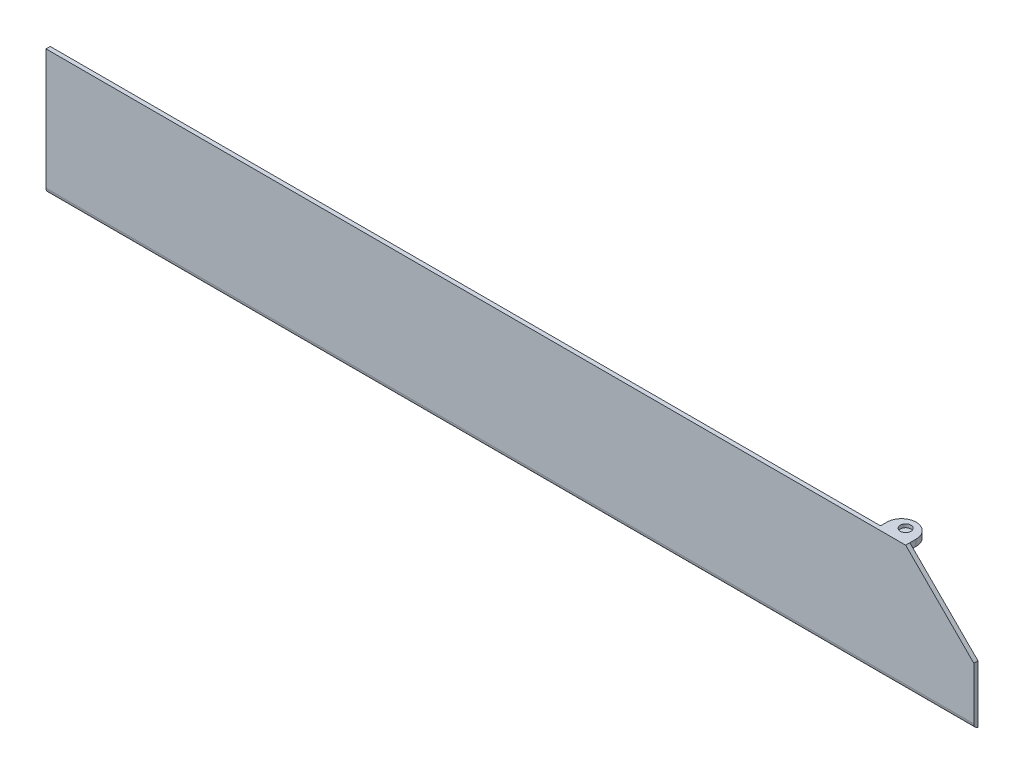
ISO-10303-21;
HEADER;
FILE_DESCRIPTION(('STEP AP214'),'2;1');
FILE_NAME('part.step','',(''),(''),'','','');
FILE_SCHEMA(('AUTOMOTIVE_DESIGN { 1 0 10303 214 1 1 1 1 }'));
ENDSEC;
DATA;
#1=APPLICATION_CONTEXT('core data for automotive mechanical design processes');
#2=APPLICATION_PROTOCOL_DEFINITION('international standard','automotive_design',2000,#1);
#3=PRODUCT_CONTEXT('',#1,'mechanical');
#4=PRODUCT('Part','Part','',(#3));
#5=PRODUCT_RELATED_PRODUCT_CATEGORY('part','',(#4));
#6=PRODUCT_DEFINITION_FORMATION('','',#4);
#7=PRODUCT_DEFINITION_CONTEXT('part definition',#1,'design');
#8=PRODUCT_DEFINITION('design','',#6,#7);
#9=PRODUCT_DEFINITION_SHAPE('','',#8);
#10=(LENGTH_UNIT() NAMED_UNIT(*) SI_UNIT(.MILLI.,.METRE.));
#11=(NAMED_UNIT(*) PLANE_ANGLE_UNIT() SI_UNIT($,.RADIAN.));
#12=(NAMED_UNIT(*) SI_UNIT($,.STERADIAN.) SOLID_ANGLE_UNIT());
#13=UNCERTAINTY_MEASURE_WITH_UNIT(LENGTH_MEASURE(1.E-05),#10,'distance_accuracy_value','');
#14=(GEOMETRIC_REPRESENTATION_CONTEXT(3) GLOBAL_UNCERTAINTY_ASSIGNED_CONTEXT((#13)) GLOBAL_UNIT_ASSIGNED_CONTEXT((#10,
#11,#12)) REPRESENTATION_CONTEXT('',''));
#15=CARTESIAN_POINT('',(0.,0.,0.));
#16=DIRECTION('',(0.,0.,1.));
#17=DIRECTION('',(1.,0.,0.));
#18=AXIS2_PLACEMENT_3D('',#15,#16,#17);
#19=CARTESIAN_POINT('',(0.,0.,0.));
#20=DIRECTION('',(0.,0.,1.));
#21=DIRECTION('',(1.,0.,0.));
#22=AXIS2_PLACEMENT_3D('',#19,#20,#21);
#23=PLANE('',#22);
#24=DIRECTION('',(0.,-1.,0.));
#25=VECTOR('',#24,1.);
#26=CARTESIAN_POINT('',(865.,35.,0.));
#27=LINE('',#26,#25);
#28=CARTESIAN_POINT('',(865.,35.,0.));
#29=VERTEX_POINT('',#28);
#30=CARTESIAN_POINT('',(865.,25.,0.));
#31=VERTEX_POINT('',#30);
#32=EDGE_CURVE('E241',#29,#31,#27,.T.);
#33=ORIENTED_EDGE('',*,*,#32,.F.);
#34=DIRECTION('',(1.,0.,0.));
#35=VECTOR('',#34,1.);
#36=CARTESIAN_POINT('',(865.,35.,0.));
#37=LINE('',#36,#35);
#38=CARTESIAN_POINT('',(860.,35.,0.));
#39=VERTEX_POINT('',#38);
#40=EDGE_CURVE('E250',#39,#29,#37,.T.);
#41=ORIENTED_EDGE('',*,*,#40,.F.);
#42=DIRECTION('',(0.,1.,0.));
#43=VECTOR('',#42,1.);
#44=CARTESIAN_POINT('',(860.,35.,0.));
#45=LINE('',#44,#43);
#46=CARTESIAN_POINT('',(860.,25.,0.));
#47=VERTEX_POINT('',#46);
#48=EDGE_CURVE('E247',#47,#39,#45,.T.);
#49=ORIENTED_EDGE('',*,*,#48,.F.);
#50=DIRECTION('',(-1.,0.,0.));
#51=VECTOR('',#50,1.);
#52=CARTESIAN_POINT('',(865.,25.,0.));
#53=LINE('',#52,#51);
#54=EDGE_CURVE('E244',#31,#47,#53,.T.);
#55=ORIENTED_EDGE('',*,*,#54,.F.);
#56=EDGE_LOOP('',(#33,#41,#49,#55));
#57=FACE_BOUND('',#56,.T.);
#58=DIRECTION('',(0.,-1.,0.));
#59=VECTOR('',#58,1.);
#60=CARTESIAN_POINT('',(25.,85.0000000000001,0.));
#61=LINE('',#60,#59);
#62=CARTESIAN_POINT('',(25.,95.0000000000001,0.));
#63=VERTEX_POINT('',#62);
#64=CARTESIAN_POINT('',(25.,85.0000000000001,0.));
#65=VERTEX_POINT('',#64);
#66=EDGE_CURVE('E293',#63,#65,#61,.T.);
#67=ORIENTED_EDGE('',*,*,#66,.F.);
#68=DIRECTION('',(1.,0.,0.));
#69=VECTOR('',#68,1.);
#70=CARTESIAN_POINT('',(25.,95.0000000000001,0.));
#71=LINE('',#70,#69);
#72=CARTESIAN_POINT('',(20.,95.0000000000001,0.));
#73=VERTEX_POINT('',#72);
#74=EDGE_CURVE('E302',#73,#63,#71,.T.);
#75=ORIENTED_EDGE('',*,*,#74,.F.);
#76=DIRECTION('',(0.,1.,0.));
#77=VECTOR('',#76,1.);
#78=CARTESIAN_POINT('',(20.,85.0000000000001,0.));
#79=LINE('',#78,#77);
#80=CARTESIAN_POINT('',(20.,85.0000000000001,0.));
#81=VERTEX_POINT('',#80);
#82=EDGE_CURVE('E299',#81,#73,#79,.T.);
#83=ORIENTED_EDGE('',*,*,#82,.F.);
#84=DIRECTION('',(-1.,0.,0.));
#85=VECTOR('',#84,1.);
#86=CARTESIAN_POINT('',(25.,85.0000000000001,0.));
#87=LINE('',#86,#85);
#88=EDGE_CURVE('E296',#65,#81,#87,.T.);
#89=ORIENTED_EDGE('',*,*,#88,.F.);
#90=EDGE_LOOP('',(#67,#75,#83,#89));
#91=FACE_BOUND('',#90,.T.);
#92=DIRECTION('',(0.,1.,0.));
#93=VECTOR('',#92,1.);
#94=CARTESIAN_POINT('',(20.,30.0000000000001,0.));
#95=LINE('',#94,#93);
#96=CARTESIAN_POINT('',(20.,30.0000000000001,0.));
#97=VERTEX_POINT('',#96);
#98=CARTESIAN_POINT('',(20.,40.0000000000001,0.));
#99=VERTEX_POINT('',#98);
#100=EDGE_CURVE('E290',#97,#99,#95,.T.);
#101=ORIENTED_EDGE('',*,*,#100,.F.);
#102=DIRECTION('',(-1.,0.,0.));
#103=VECTOR('',#102,1.);
#104=CARTESIAN_POINT('',(20.,30.0000000000001,0.));
#105=LINE('',#104,#103);
#106=CARTESIAN_POINT('',(25.,30.0000000000001,0.));
#107=VERTEX_POINT('',#106);
#108=EDGE_CURVE('E281',#107,#97,#105,.T.);
#109=ORIENTED_EDGE('',*,*,#108,.F.);
#110=DIRECTION('',(0.,-1.,0.));
#111=VECTOR('',#110,1.);
#112=CARTESIAN_POINT('',(25.,30.0000000000001,0.));
#113=LINE('',#112,#111);
#114=CARTESIAN_POINT('',(25.,40.0000000000001,0.));
#115=VERTEX_POINT('',#114);
#116=EDGE_CURVE('E284',#115,#107,#113,.T.);
#117=ORIENTED_EDGE('',*,*,#116,.F.);
#118=DIRECTION('',(1.,0.,0.));
#119=VECTOR('',#118,1.);
#120=CARTESIAN_POINT('',(20.,40.0000000000001,0.));
#121=LINE('',#120,#119);
#122=EDGE_CURVE('E287',#99,#115,#121,.T.);
#123=ORIENTED_EDGE('',*,*,#122,.F.);
#124=EDGE_LOOP('',(#101,#109,#117,#123));
#125=FACE_BOUND('',#124,.T.);
#126=DIRECTION('',(0.,-1.,0.));
#127=VECTOR('',#126,1.);
#128=CARTESIAN_POINT('',(820.,120.,0.));
#129=LINE('',#128,#127);
#130=CARTESIAN_POINT('',(820.,120.,0.));
#131=VERTEX_POINT('',#130);
#132=CARTESIAN_POINT('',(820.,114.,0.));
#133=VERTEX_POINT('',#132);
#134=EDGE_CURVE('E217',#131,#133,#129,.T.);
#135=ORIENTED_EDGE('',*,*,#134,.F.);
#136=DIRECTION('',(-0.70710678118655,0.707106781186545,0.));
#137=VECTOR('',#136,1.);
#138=CARTESIAN_POINT('',(885.,55.,0.));
#139=LINE('',#138,#137);
#140=CARTESIAN_POINT('',(885.,55.,0.));
#141=VERTEX_POINT('',#140);
#142=EDGE_CURVE('E329',#141,#131,#139,.T.);
#143=ORIENTED_EDGE('',*,*,#142,.F.);
#144=DIRECTION('',(0.,1.,0.));
#145=VECTOR('',#144,1.);
#146=CARTESIAN_POINT('',(885.,0.,0.));
#147=LINE('',#146,#145);
#148=CARTESIAN_POINT('',(885.,0.,0.));
#149=VERTEX_POINT('',#148);
#150=EDGE_CURVE('E327',#149,#141,#147,.T.);
#151=ORIENTED_EDGE('',*,*,#150,.F.);
#152=DIRECTION('',(1.,0.,0.));
#153=VECTOR('',#152,1.);
#154=CARTESIAN_POINT('',(0.,0.,0.));
#155=LINE('',#154,#153);
#156=CARTESIAN_POINT('',(0.,0.,0.));
#157=VERTEX_POINT('',#156);
#158=EDGE_CURVE('E325',#157,#149,#155,.T.);
#159=ORIENTED_EDGE('',*,*,#158,.F.);
#160=DIRECTION('',(0.,-1.,0.));
#161=VECTOR('',#160,1.);
#162=CARTESIAN_POINT('',(0.,120.,0.));
#163=LINE('',#162,#161);
#164=CARTESIAN_POINT('',(0.,120.,0.));
#165=VERTEX_POINT('',#164);
#166=EDGE_CURVE('E313',#165,#157,#163,.T.);
#167=ORIENTED_EDGE('',*,*,#166,.F.);
#168=DIRECTION('',(-1.,0.,0.));
#169=VECTOR('',#168,1.);
#170=CARTESIAN_POINT('',(820.,120.,0.));
#171=LINE('',#170,#169);
#172=CARTESIAN_POINT('',(791.999999999999,120.,0.));
#173=VERTEX_POINT('',#172);
#174=EDGE_CURVE('E317',#173,#165,#171,.T.);
#175=ORIENTED_EDGE('',*,*,#174,.F.);
#176=DIRECTION('',(0.,1.,0.));
#177=VECTOR('',#176,1.);
#178=CARTESIAN_POINT('',(791.999999999999,120.,0.));
#179=LINE('',#178,#177);
#180=CARTESIAN_POINT('',(791.999999999999,114.,0.));
#181=VERTEX_POINT('',#180);
#182=EDGE_CURVE('E228',#181,#173,#179,.T.);
#183=ORIENTED_EDGE('',*,*,#182,.F.);
#184=DIRECTION('',(-1.,0.,0.));
#185=VECTOR('',#184,1.);
#186=CARTESIAN_POINT('',(820.,114.,0.));
#187=LINE('',#186,#185);
#188=EDGE_CURVE('E207',#133,#181,#187,.T.);
#189=ORIENTED_EDGE('',*,*,#188,.F.);
#190=EDGE_LOOP('',(#135,#143,#151,#159,#167,#175,#183,#189));
#191=FACE_BOUND('',#190,.T.);
#192=ADVANCED_FACE('F38',(#57,#91,#125,#191),#23,.F.);
#193=CARTESIAN_POINT('',(0.,120.,4.));
#194=DIRECTION('',(1.,0.,0.));
#195=DIRECTION('',(0.,0.,-1.));
#196=AXIS2_PLACEMENT_3D('',#193,#194,#195);
#197=PLANE('',#196);
#198=ORIENTED_EDGE('',*,*,#166,.T.);
#199=CARTESIAN_POINT('',(0.,4.89897948556636,-1.));
#200=DIRECTION('',(1.,0.,0.));
#201=DIRECTION('',(0.,0.,-1.));
#202=AXIS2_PLACEMENT_3D('',#199,#200,#201);
#203=CIRCLE('',#202,5.);
#204=CARTESIAN_POINT('',(0.,4.89897948556636,4.));
#205=VERTEX_POINT('',#204);
#206=EDGE_CURVE('E11',#157,#205,#203,.F.);
#207=ORIENTED_EDGE('',*,*,#206,.T.);
#208=DIRECTION('',(0.,-1.,0.));
#209=VECTOR('',#208,1.);
#210=CARTESIAN_POINT('',(0.,120.,4.));
#211=LINE('',#210,#209);
#212=CARTESIAN_POINT('',(0.,120.,4.));
#213=VERTEX_POINT('',#212);
#214=EDGE_CURVE('E314',#213,#205,#211,.T.);
#215=ORIENTED_EDGE('',*,*,#214,.F.);
#216=DIRECTION('',(0.,0.,-1.));
#217=VECTOR('',#216,1.);
#218=CARTESIAN_POINT('',(0.,120.,4.));
#219=LINE('',#218,#217);
#220=EDGE_CURVE('E323',#213,#165,#219,.T.);
#221=ORIENTED_EDGE('',*,*,#220,.T.);
#222=EDGE_LOOP('',(#198,#207,#215,#221));
#223=FACE_BOUND('',#222,.T.);
#224=ADVANCED_FACE('F416',(#223),#197,.F.);
#225=CARTESIAN_POINT('',(885.,0.,4.));
#226=DIRECTION('',(-1.,0.,0.));
#227=DIRECTION('',(0.,0.,1.));
#228=AXIS2_PLACEMENT_3D('',#225,#226,#227);
#229=PLANE('',#228);
#230=DIRECTION('',(0.,1.,0.));
#231=VECTOR('',#230,1.);
#232=CARTESIAN_POINT('',(885.,0.,4.));
#233=LINE('',#232,#231);
#234=CARTESIAN_POINT('',(885.,4.89897948556636,4.));
#235=VERTEX_POINT('',#234);
#236=CARTESIAN_POINT('',(885.,55.,4.));
#237=VERTEX_POINT('',#236);
#238=EDGE_CURVE('E316',#235,#237,#233,.T.);
#239=ORIENTED_EDGE('',*,*,#238,.F.);
#240=CARTESIAN_POINT('',(885.,4.89897948556636,-1.));
#241=DIRECTION('',(-1.,0.,0.));
#242=DIRECTION('',(0.,0.,1.));
#243=AXIS2_PLACEMENT_3D('',#240,#241,#242);
#244=CIRCLE('',#243,5.);
#245=EDGE_CURVE('E46',#235,#149,#244,.F.);
#246=ORIENTED_EDGE('',*,*,#245,.T.);
#247=ORIENTED_EDGE('',*,*,#150,.T.);
#248=DIRECTION('',(0.,0.,-1.));
#249=VECTOR('',#248,1.);
#250=CARTESIAN_POINT('',(885.,55.,4.));
#251=LINE('',#250,#249);
#252=EDGE_CURVE('E337',#237,#141,#251,.T.);
#253=ORIENTED_EDGE('',*,*,#252,.F.);
#254=EDGE_LOOP('',(#239,#246,#247,#253));
#255=FACE_BOUND('',#254,.T.);
#256=ADVANCED_FACE('F409',(#255),#229,.F.);
#257=CARTESIAN_POINT('',(885.,55.,4.));
#258=DIRECTION('',(-0.707106781186545,-0.70710678118655,0.));
#259=DIRECTION('',(0.70710678118655,-0.707106781186545,0.));
#260=AXIS2_PLACEMENT_3D('',#257,#258,#259);
#261=PLANE('',#260);
#262=ORIENTED_EDGE('',*,*,#142,.T.);
#263=DIRECTION('',(0.,0.,-1.));
#264=VECTOR('',#263,1.);
#265=CARTESIAN_POINT('',(820.,120.,4.));
#266=LINE('',#265,#264);
#267=CARTESIAN_POINT('',(820.,120.,4.));
#268=VERTEX_POINT('',#267);
#269=EDGE_CURVE('E334',#268,#131,#266,.T.);
#270=ORIENTED_EDGE('',*,*,#269,.F.);
#271=DIRECTION('',(-0.70710678118655,0.707106781186545,0.));
#272=VECTOR('',#271,1.);
#273=CARTESIAN_POINT('',(885.,55.,4.));
#274=LINE('',#273,#272);
#275=EDGE_CURVE('E319',#237,#268,#274,.T.);
#276=ORIENTED_EDGE('',*,*,#275,.F.);
#277=ORIENTED_EDGE('',*,*,#252,.T.);
#278=EDGE_LOOP('',(#262,#270,#276,#277));
#279=FACE_BOUND('',#278,.T.);
#280=ADVANCED_FACE('F452',(#279),#261,.F.);
#281=CARTESIAN_POINT('',(820.,120.,4.));
#282=DIRECTION('',(0.,-1.,0.));
#283=DIRECTION('',(1.,0.,0.));
#284=AXIS2_PLACEMENT_3D('',#281,#282,#283);
#285=PLANE('',#284);
#286=CARTESIAN_POINT('',(806.,120.,-10.));
#287=DIRECTION('',(0.,1.,0.));
#288=DIRECTION('',(-1.,0.,0.));
#289=AXIS2_PLACEMENT_3D('',#286,#287,#288);
#290=CIRCLE('',#289,5.09999999999998);
#291=CARTESIAN_POINT('',(800.9,120.,-10.));
#292=VERTEX_POINT('',#291);
#293=EDGE_CURVE('E405',#292,#292,#290,.T.);
#294=ORIENTED_EDGE('',*,*,#293,.F.);
#295=EDGE_LOOP('',(#294));
#296=FACE_BOUND('',#295,.T.);
#297=CARTESIAN_POINT('',(806.,120.,-6.));
#298=DIRECTION('',(0.,-1.,0.));
#299=DIRECTION('',(1.,0.,0.));
#300=AXIS2_PLACEMENT_3D('',#297,#298,#299);
#301=CIRCLE('',#300,14.);
#302=CARTESIAN_POINT('',(820.,120.,-6.));
#303=VERTEX_POINT('',#302);
#304=CARTESIAN_POINT('',(806.,120.,-20.));
#305=VERTEX_POINT('',#304);
#306=EDGE_CURVE('E387',#303,#305,#301,.F.);
#307=ORIENTED_EDGE('',*,*,#306,.T.);
#308=CARTESIAN_POINT('',(806.,120.,-6.));
#309=DIRECTION('',(0.,-1.,0.));
#310=DIRECTION('',(1.,0.,0.));
#311=AXIS2_PLACEMENT_3D('',#308,#309,#310);
#312=CIRCLE('',#311,14.);
#313=CARTESIAN_POINT('',(791.999999999999,120.,-6.));
#314=VERTEX_POINT('',#313);
#315=EDGE_CURVE('E391',#305,#314,#312,.F.);
#316=ORIENTED_EDGE('',*,*,#315,.T.);
#317=DIRECTION('',(0.,0.,1.));
#318=VECTOR('',#317,1.);
#319=CARTESIAN_POINT('',(791.999999999999,120.,-20.));
#320=LINE('',#319,#318);
#321=EDGE_CURVE('E234',#314,#173,#320,.T.);
#322=ORIENTED_EDGE('',*,*,#321,.T.);
#323=ORIENTED_EDGE('',*,*,#174,.T.);
#324=ORIENTED_EDGE('',*,*,#220,.F.);
#325=DIRECTION('',(-1.,0.,0.));
#326=VECTOR('',#325,1.);
#327=CARTESIAN_POINT('',(820.,120.,4.));
#328=LINE('',#327,#326);
#329=EDGE_CURVE('E321',#268,#213,#328,.T.);
#330=ORIENTED_EDGE('',*,*,#329,.F.);
#331=ORIENTED_EDGE('',*,*,#269,.T.);
#332=DIRECTION('',(0.,0.,1.));
#333=VECTOR('',#332,1.);
#334=CARTESIAN_POINT('',(820.,120.,-20.));
#335=LINE('',#334,#333);
#336=EDGE_CURVE('E220',#303,#131,#335,.T.);
#337=ORIENTED_EDGE('',*,*,#336,.F.);
#338=EDGE_LOOP('',(#307,#316,#322,#323,#324,#330,#331,#337));
#339=FACE_BOUND('',#338,.T.);
#340=ADVANCED_FACE('F418',(#296,#339),#285,.F.);
#341=CARTESIAN_POINT('',(0.,0.,4.));
#342=DIRECTION('',(0.,0.,1.));
#343=DIRECTION('',(1.,0.,0.));
#344=AXIS2_PLACEMENT_3D('',#341,#342,#343);
#345=PLANE('',#344);
#346=ORIENTED_EDGE('',*,*,#214,.T.);
#347=DIRECTION('',(-1.,0.,0.));
#348=VECTOR('',#347,1.);
#349=CARTESIAN_POINT('',(885.,4.89897948556636,4.));
#350=LINE('',#349,#348);
#351=EDGE_CURVE('E401',#205,#235,#350,.F.);
#352=ORIENTED_EDGE('',*,*,#351,.T.);
#353=ORIENTED_EDGE('',*,*,#238,.T.);
#354=ORIENTED_EDGE('',*,*,#275,.T.);
#355=ORIENTED_EDGE('',*,*,#329,.T.);
#356=EDGE_LOOP('',(#346,#352,#353,#354,#355));
#357=FACE_BOUND('',#356,.T.);
#358=ADVANCED_FACE('F413',(#357),#345,.T.);
#359=CARTESIAN_POINT('',(25.,85.0000000000001,-20.));
#360=DIRECTION('',(-1.,0.,0.));
#361=DIRECTION('',(0.,-1.,0.));
#362=AXIS2_PLACEMENT_3D('',#359,#360,#361);
#363=PLANE('',#362);
#364=CARTESIAN_POINT('',(25.,90.0000000000001,-10.));
#365=DIRECTION('',(1.,0.,0.));
#366=DIRECTION('',(0.,1.,0.));
#367=AXIS2_PLACEMENT_3D('',#364,#365,#366);
#368=CIRCLE('',#367,2.65);
#369=CARTESIAN_POINT('',(25.,92.6500000000001,-10.));
#370=VERTEX_POINT('',#369);
#371=EDGE_CURVE('E262',#370,#370,#368,.T.);
#372=ORIENTED_EDGE('',*,*,#371,.F.);
#373=EDGE_LOOP('',(#372));
#374=FACE_BOUND('',#373,.T.);
#375=DIRECTION('',(0.,0.,1.));
#376=VECTOR('',#375,1.);
#377=CARTESIAN_POINT('',(25.,85.0000000000001,-20.));
#378=LINE('',#377,#376);
#379=CARTESIAN_POINT('',(25.,85.0000000000001,-15.));
#380=VERTEX_POINT('',#379);
#381=EDGE_CURVE('E311',#380,#65,#378,.T.);
#382=ORIENTED_EDGE('',*,*,#381,.F.);
#383=CARTESIAN_POINT('',(25.,90.0000000000001,-15.));
#384=DIRECTION('',(-1.,0.,0.));
#385=DIRECTION('',(0.,-1.,0.));
#386=AXIS2_PLACEMENT_3D('',#383,#384,#385);
#387=CIRCLE('',#386,5.);
#388=CARTESIAN_POINT('',(25.,90.0000000000001,-20.));
#389=VERTEX_POINT('',#388);
#390=EDGE_CURVE('E364',#380,#389,#387,.F.);
#391=ORIENTED_EDGE('',*,*,#390,.T.);
#392=CARTESIAN_POINT('',(25.,90.0000000000001,-15.));
#393=DIRECTION('',(-1.,0.,0.));
#394=DIRECTION('',(0.,-1.,0.));
#395=AXIS2_PLACEMENT_3D('',#392,#393,#394);
#396=CIRCLE('',#395,5.);
#397=CARTESIAN_POINT('',(25.,95.0000000000001,-15.));
#398=VERTEX_POINT('',#397);
#399=EDGE_CURVE('E362',#389,#398,#396,.F.);
#400=ORIENTED_EDGE('',*,*,#399,.T.);
#401=DIRECTION('',(0.,0.,1.));
#402=VECTOR('',#401,1.);
#403=CARTESIAN_POINT('',(25.,95.0000000000001,-20.));
#404=LINE('',#403,#402);
#405=EDGE_CURVE('E305',#398,#63,#404,.T.);
#406=ORIENTED_EDGE('',*,*,#405,.T.);
#407=ORIENTED_EDGE('',*,*,#66,.T.);
#408=EDGE_LOOP('',(#382,#391,#400,#406,#407));
#409=FACE_BOUND('',#408,.T.);
#410=ADVANCED_FACE('F552',(#374,#409),#363,.F.);
#411=CARTESIAN_POINT('',(25.,85.0000000000001,-20.));
#412=DIRECTION('',(0.,1.,0.));
#413=DIRECTION('',(0.,0.,1.));
#414=AXIS2_PLACEMENT_3D('',#411,#412,#413);
#415=PLANE('',#414);
#416=DIRECTION('',(0.,0.,1.));
#417=VECTOR('',#416,1.);
#418=CARTESIAN_POINT('',(20.,85.0000000000001,-20.));
#419=LINE('',#418,#417);
#420=CARTESIAN_POINT('',(20.,85.0000000000001,-15.));
#421=VERTEX_POINT('',#420);
#422=EDGE_CURVE('E309',#421,#81,#419,.T.);
#423=ORIENTED_EDGE('',*,*,#422,.F.);
#424=DIRECTION('',(-1.,0.,0.));
#425=VECTOR('',#424,1.);
#426=CARTESIAN_POINT('',(25.,85.0000000000001,-15.));
#427=LINE('',#426,#425);
#428=EDGE_CURVE('E359',#421,#380,#427,.F.);
#429=ORIENTED_EDGE('',*,*,#428,.T.);
#430=ORIENTED_EDGE('',*,*,#381,.T.);
#431=ORIENTED_EDGE('',*,*,#88,.T.);
#432=EDGE_LOOP('',(#423,#429,#430,#431));
#433=FACE_BOUND('',#432,.T.);
#434=ADVANCED_FACE('F549',(#433),#415,.F.);
#435=CARTESIAN_POINT('',(20.,85.0000000000001,-20.));
#436=DIRECTION('',(1.,0.,0.));
#437=DIRECTION('',(0.,1.,0.));
#438=AXIS2_PLACEMENT_3D('',#435,#436,#437);
#439=PLANE('',#438);
#440=CARTESIAN_POINT('',(20.,90.0000000000001,-10.));
#441=DIRECTION('',(1.,0.,0.));
#442=DIRECTION('',(0.,1.,0.));
#443=AXIS2_PLACEMENT_3D('',#440,#441,#442);
#444=CIRCLE('',#443,2.65);
#445=CARTESIAN_POINT('',(20.,92.6500000000001,-10.));
#446=VERTEX_POINT('',#445);
#447=EDGE_CURVE('E272',#446,#446,#444,.T.);
#448=ORIENTED_EDGE('',*,*,#447,.T.);
#449=EDGE_LOOP('',(#448));
#450=FACE_BOUND('',#449,.T.);
#451=CARTESIAN_POINT('',(20.,90.0000000000001,-15.));
#452=DIRECTION('',(1.,0.,0.));
#453=DIRECTION('',(0.,1.,0.));
#454=AXIS2_PLACEMENT_3D('',#451,#452,#453);
#455=CIRCLE('',#454,5.);
#456=CARTESIAN_POINT('',(20.,95.0000000000001,-15.));
#457=VERTEX_POINT('',#456);
#458=CARTESIAN_POINT('',(20.,90.0000000000001,-20.));
#459=VERTEX_POINT('',#458);
#460=EDGE_CURVE('E355',#457,#459,#455,.F.);
#461=ORIENTED_EDGE('',*,*,#460,.T.);
#462=CARTESIAN_POINT('',(20.,90.0000000000001,-15.));
#463=DIRECTION('',(1.,0.,0.));
#464=DIRECTION('',(0.,1.,0.));
#465=AXIS2_PLACEMENT_3D('',#462,#463,#464);
#466=CIRCLE('',#465,5.);
#467=EDGE_CURVE('E357',#459,#421,#466,.F.);
#468=ORIENTED_EDGE('',*,*,#467,.T.);
#469=ORIENTED_EDGE('',*,*,#422,.T.);
#470=ORIENTED_EDGE('',*,*,#82,.T.);
#471=DIRECTION('',(0.,0.,1.));
#472=VECTOR('',#471,1.);
#473=CARTESIAN_POINT('',(20.,95.0000000000001,-20.));
#474=LINE('',#473,#472);
#475=EDGE_CURVE('E307',#457,#73,#474,.T.);
#476=ORIENTED_EDGE('',*,*,#475,.F.);
#477=EDGE_LOOP('',(#461,#468,#469,#470,#476));
#478=FACE_BOUND('',#477,.T.);
#479=ADVANCED_FACE('F545',(#450,#478),#439,.F.);
#480=CARTESIAN_POINT('',(25.,95.0000000000001,-20.));
#481=DIRECTION('',(0.,-1.,0.));
#482=DIRECTION('',(0.,0.,-1.));
#483=AXIS2_PLACEMENT_3D('',#480,#481,#482);
#484=PLANE('',#483);
#485=ORIENTED_EDGE('',*,*,#405,.F.);
#486=DIRECTION('',(1.,0.,0.));
#487=VECTOR('',#486,1.);
#488=CARTESIAN_POINT('',(25.,95.0000000000001,-15.));
#489=LINE('',#488,#487);
#490=EDGE_CURVE('E366',#398,#457,#489,.F.);
#491=ORIENTED_EDGE('',*,*,#490,.T.);
#492=ORIENTED_EDGE('',*,*,#475,.T.);
#493=ORIENTED_EDGE('',*,*,#74,.T.);
#494=EDGE_LOOP('',(#485,#491,#492,#493));
#495=FACE_BOUND('',#494,.T.);
#496=ADVANCED_FACE('F531',(#495),#484,.F.);
#497=CARTESIAN_POINT('',(20.,30.0000000000001,-20.));
#498=DIRECTION('',(1.,0.,0.));
#499=DIRECTION('',(0.,1.,0.));
#500=AXIS2_PLACEMENT_3D('',#497,#498,#499);
#501=PLANE('',#500);
#502=CARTESIAN_POINT('',(20.,35.0000000000001,-10.));
#503=DIRECTION('',(1.,0.,0.));
#504=DIRECTION('',(0.,1.,0.));
#505=AXIS2_PLACEMENT_3D('',#502,#503,#504);
#506=CIRCLE('',#505,2.65);
#507=CARTESIAN_POINT('',(20.,37.6500000000001,-10.));
#508=VERTEX_POINT('',#507);
#509=EDGE_CURVE('E265',#508,#508,#506,.T.);
#510=ORIENTED_EDGE('',*,*,#509,.T.);
#511=EDGE_LOOP('',(#510));
#512=FACE_BOUND('',#511,.T.);
#513=CARTESIAN_POINT('',(20.,35.0000000000001,-15.));
#514=DIRECTION('',(1.,0.,0.));
#515=DIRECTION('',(0.,1.,0.));
#516=AXIS2_PLACEMENT_3D('',#513,#514,#515);
#517=CIRCLE('',#516,5.);
#518=CARTESIAN_POINT('',(20.,40.0000000000001,-15.));
#519=VERTEX_POINT('',#518);
#520=CARTESIAN_POINT('',(20.,35.0000000000001,-20.));
#521=VERTEX_POINT('',#520);
#522=EDGE_CURVE('E340',#519,#521,#517,.F.);
#523=ORIENTED_EDGE('',*,*,#522,.T.);
#524=CARTESIAN_POINT('',(20.,35.0000000000001,-15.));
#525=DIRECTION('',(1.,0.,0.));
#526=DIRECTION('',(0.,1.,0.));
#527=AXIS2_PLACEMENT_3D('',#524,#525,#526);
#528=CIRCLE('',#527,5.);
#529=CARTESIAN_POINT('',(20.,30.0000000000001,-15.));
#530=VERTEX_POINT('',#529);
#531=EDGE_CURVE('E344',#521,#530,#528,.F.);
#532=ORIENTED_EDGE('',*,*,#531,.T.);
#533=DIRECTION('',(0.,0.,1.));
#534=VECTOR('',#533,1.);
#535=CARTESIAN_POINT('',(20.,30.0000000000001,-20.));
#536=LINE('',#535,#534);
#537=EDGE_CURVE('E279',#530,#97,#536,.T.);
#538=ORIENTED_EDGE('',*,*,#537,.T.);
#539=ORIENTED_EDGE('',*,*,#100,.T.);
#540=DIRECTION('',(0.,0.,1.));
#541=VECTOR('',#540,1.);
#542=CARTESIAN_POINT('',(20.,40.0000000000001,-20.));
#543=LINE('',#542,#541);
#544=EDGE_CURVE('E273',#519,#99,#543,.T.);
#545=ORIENTED_EDGE('',*,*,#544,.F.);
#546=EDGE_LOOP('',(#523,#532,#538,#539,#545));
#547=FACE_BOUND('',#546,.T.);
#548=ADVANCED_FACE('F527',(#512,#547),#501,.F.);
#549=CARTESIAN_POINT('',(20.,40.0000000000001,-20.));
#550=DIRECTION('',(0.,-1.,0.));
#551=DIRECTION('',(0.,0.,-1.));
#552=AXIS2_PLACEMENT_3D('',#549,#550,#551);
#553=PLANE('',#552);
#554=DIRECTION('',(0.,0.,1.));
#555=VECTOR('',#554,1.);
#556=CARTESIAN_POINT('',(25.,40.0000000000001,-20.));
#557=LINE('',#556,#555);
#558=CARTESIAN_POINT('',(25.,40.0000000000001,-15.));
#559=VERTEX_POINT('',#558);
#560=EDGE_CURVE('E275',#559,#115,#557,.T.);
#561=ORIENTED_EDGE('',*,*,#560,.F.);
#562=DIRECTION('',(1.,0.,0.));
#563=VECTOR('',#562,1.);
#564=CARTESIAN_POINT('',(20.,40.0000000000001,-15.));
#565=LINE('',#564,#563);
#566=EDGE_CURVE('E353',#559,#519,#565,.F.);
#567=ORIENTED_EDGE('',*,*,#566,.T.);
#568=ORIENTED_EDGE('',*,*,#544,.T.);
#569=ORIENTED_EDGE('',*,*,#122,.T.);
#570=EDGE_LOOP('',(#561,#567,#568,#569));
#571=FACE_BOUND('',#570,.T.);
#572=ADVANCED_FACE('F530',(#571),#553,.F.);
#573=CARTESIAN_POINT('',(25.,30.0000000000001,-20.));
#574=DIRECTION('',(-1.,0.,0.));
#575=DIRECTION('',(0.,-1.,0.));
#576=AXIS2_PLACEMENT_3D('',#573,#574,#575);
#577=PLANE('',#576);
#578=CARTESIAN_POINT('',(25.,35.0000000000001,-10.));
#579=DIRECTION('',(1.,0.,0.));
#580=DIRECTION('',(0.,1.,0.));
#581=AXIS2_PLACEMENT_3D('',#578,#579,#580);
#582=CIRCLE('',#581,2.65);
#583=CARTESIAN_POINT('',(25.,37.6500000000001,-10.));
#584=VERTEX_POINT('',#583);
#585=EDGE_CURVE('E266',#584,#584,#582,.T.);
#586=ORIENTED_EDGE('',*,*,#585,.F.);
#587=EDGE_LOOP('',(#586));
#588=FACE_BOUND('',#587,.T.);
#589=DIRECTION('',(0.,0.,1.));
#590=VECTOR('',#589,1.);
#591=CARTESIAN_POINT('',(25.,30.0000000000001,-20.));
#592=LINE('',#591,#590);
#593=CARTESIAN_POINT('',(25.,30.0000000000001,-15.));
#594=VERTEX_POINT('',#593);
#595=EDGE_CURVE('E277',#594,#107,#592,.T.);
#596=ORIENTED_EDGE('',*,*,#595,.F.);
#597=CARTESIAN_POINT('',(25.,35.0000000000001,-15.));
#598=DIRECTION('',(-1.,0.,0.));
#599=DIRECTION('',(0.,-1.,0.));
#600=AXIS2_PLACEMENT_3D('',#597,#598,#599);
#601=CIRCLE('',#600,5.);
#602=CARTESIAN_POINT('',(25.,35.0000000000001,-20.));
#603=VERTEX_POINT('',#602);
#604=EDGE_CURVE('E351',#594,#603,#601,.F.);
#605=ORIENTED_EDGE('',*,*,#604,.T.);
#606=CARTESIAN_POINT('',(25.,35.0000000000001,-15.));
#607=DIRECTION('',(-1.,0.,0.));
#608=DIRECTION('',(0.,-1.,0.));
#609=AXIS2_PLACEMENT_3D('',#606,#607,#608);
#610=CIRCLE('',#609,5.);
#611=EDGE_CURVE('E349',#603,#559,#610,.F.);
#612=ORIENTED_EDGE('',*,*,#611,.T.);
#613=ORIENTED_EDGE('',*,*,#560,.T.);
#614=ORIENTED_EDGE('',*,*,#116,.T.);
#615=EDGE_LOOP('',(#596,#605,#612,#613,#614));
#616=FACE_BOUND('',#615,.T.);
#617=ADVANCED_FACE('F535',(#588,#616),#577,.F.);
#618=CARTESIAN_POINT('',(20.,30.0000000000001,-20.));
#619=DIRECTION('',(0.,1.,0.));
#620=DIRECTION('',(0.,0.,1.));
#621=AXIS2_PLACEMENT_3D('',#618,#619,#620);
#622=PLANE('',#621);
#623=ORIENTED_EDGE('',*,*,#537,.F.);
#624=DIRECTION('',(-1.,0.,0.));
#625=VECTOR('',#624,1.);
#626=CARTESIAN_POINT('',(25.,30.0000000000001,-15.));
#627=LINE('',#626,#625);
#628=EDGE_CURVE('E346',#530,#594,#627,.F.);
#629=ORIENTED_EDGE('',*,*,#628,.T.);
#630=ORIENTED_EDGE('',*,*,#595,.T.);
#631=ORIENTED_EDGE('',*,*,#108,.T.);
#632=EDGE_LOOP('',(#623,#629,#630,#631));
#633=FACE_BOUND('',#632,.T.);
#634=ADVANCED_FACE('F525',(#633),#622,.F.);
#635=CARTESIAN_POINT('',(4.99999999999998,35.0000000000001,-10.));
#636=DIRECTION('',(1.,0.,0.));
#637=DIRECTION('',(0.,1.,0.));
#638=AXIS2_PLACEMENT_3D('',#635,#636,#637);
#639=CYLINDRICAL_SURFACE('',#638,2.65);
#640=ORIENTED_EDGE('',*,*,#585,.T.);
#641=EDGE_LOOP('',(#640));
#642=FACE_BOUND('',#641,.T.);
#643=ORIENTED_EDGE('',*,*,#509,.F.);
#644=EDGE_LOOP('',(#643));
#645=FACE_BOUND('',#644,.T.);
#646=ADVANCED_FACE('F521',(#642,#645),#639,.F.);
#647=CARTESIAN_POINT('',(5.,90.0000000000001,-10.));
#648=DIRECTION('',(1.,0.,0.));
#649=DIRECTION('',(0.,1.,0.));
#650=AXIS2_PLACEMENT_3D('',#647,#648,#649);
#651=CYLINDRICAL_SURFACE('',#650,2.65);
#652=ORIENTED_EDGE('',*,*,#371,.T.);
#653=EDGE_LOOP('',(#652));
#654=FACE_BOUND('',#653,.T.);
#655=ORIENTED_EDGE('',*,*,#447,.F.);
#656=EDGE_LOOP('',(#655));
#657=FACE_BOUND('',#656,.T.);
#658=ADVANCED_FACE('F467',(#654,#657),#651,.F.);
#659=CARTESIAN_POINT('',(0.,35.0000000000001,-15.));
#660=DIRECTION('',(-1.,0.,0.));
#661=DIRECTION('',(0.,0.,1.));
#662=AXIS2_PLACEMENT_3D('',#659,#660,#661);
#663=CYLINDRICAL_SURFACE('',#662,5.);
#664=ORIENTED_EDGE('',*,*,#566,.F.);
#665=ORIENTED_EDGE('',*,*,#611,.F.);
#666=DIRECTION('',(1.,0.,0.));
#667=VECTOR('',#666,1.);
#668=CARTESIAN_POINT('',(25.,35.0000000000001,-20.));
#669=LINE('',#668,#667);
#670=EDGE_CURVE('E269',#521,#603,#669,.T.);
#671=ORIENTED_EDGE('',*,*,#670,.F.);
#672=ORIENTED_EDGE('',*,*,#522,.F.);
#673=EDGE_LOOP('',(#664,#665,#671,#672));
#674=FACE_BOUND('',#673,.T.);
#675=ADVANCED_FACE('F463',(#674),#663,.T.);
#676=CARTESIAN_POINT('',(0.,35.0000000000001,-15.));
#677=DIRECTION('',(1.,0.,0.));
#678=DIRECTION('',(0.,0.,-1.));
#679=AXIS2_PLACEMENT_3D('',#676,#677,#678);
#680=CYLINDRICAL_SURFACE('',#679,5.);
#681=ORIENTED_EDGE('',*,*,#604,.F.);
#682=ORIENTED_EDGE('',*,*,#628,.F.);
#683=ORIENTED_EDGE('',*,*,#531,.F.);
#684=ORIENTED_EDGE('',*,*,#670,.T.);
#685=EDGE_LOOP('',(#681,#682,#683,#684));
#686=FACE_BOUND('',#685,.T.);
#687=ADVANCED_FACE('F459',(#686),#680,.T.);
#688=CARTESIAN_POINT('',(0.,90.0000000000001,-15.));
#689=DIRECTION('',(1.,0.,0.));
#690=DIRECTION('',(0.,0.,-1.));
#691=AXIS2_PLACEMENT_3D('',#688,#689,#690);
#692=CYLINDRICAL_SURFACE('',#691,5.);
#693=ORIENTED_EDGE('',*,*,#490,.F.);
#694=ORIENTED_EDGE('',*,*,#399,.F.);
#695=DIRECTION('',(1.,0.,0.));
#696=VECTOR('',#695,1.);
#697=CARTESIAN_POINT('',(0.,90.0000000000001,-20.));
#698=LINE('',#697,#696);
#699=EDGE_CURVE('E261',#459,#389,#698,.T.);
#700=ORIENTED_EDGE('',*,*,#699,.F.);
#701=ORIENTED_EDGE('',*,*,#460,.F.);
#702=EDGE_LOOP('',(#693,#694,#700,#701));
#703=FACE_BOUND('',#702,.T.);
#704=ADVANCED_FACE('F462',(#703),#692,.T.);
#705=CARTESIAN_POINT('',(0.,90.0000000000001,-15.));
#706=DIRECTION('',(-1.,0.,0.));
#707=DIRECTION('',(0.,0.,1.));
#708=AXIS2_PLACEMENT_3D('',#705,#706,#707);
#709=CYLINDRICAL_SURFACE('',#708,5.);
#710=ORIENTED_EDGE('',*,*,#390,.F.);
#711=ORIENTED_EDGE('',*,*,#428,.F.);
#712=ORIENTED_EDGE('',*,*,#467,.F.);
#713=ORIENTED_EDGE('',*,*,#699,.T.);
#714=EDGE_LOOP('',(#710,#711,#712,#713));
#715=FACE_BOUND('',#714,.T.);
#716=ADVANCED_FACE('F469',(#715),#709,.T.);
#717=CARTESIAN_POINT('',(865.,35.,-20.));
#718=DIRECTION('',(-1.,0.,0.));
#719=DIRECTION('',(0.,0.,1.));
#720=AXIS2_PLACEMENT_3D('',#717,#718,#719);
#721=PLANE('',#720);
#722=CARTESIAN_POINT('',(865.,30.,-10.));
#723=DIRECTION('',(1.,0.,0.));
#724=DIRECTION('',(0.,0.,-1.));
#725=AXIS2_PLACEMENT_3D('',#722,#723,#724);
#726=CIRCLE('',#725,2.65);
#727=CARTESIAN_POINT('',(865.,30.,-12.65));
#728=VERTEX_POINT('',#727);
#729=EDGE_CURVE('E237',#728,#728,#726,.T.);
#730=ORIENTED_EDGE('',*,*,#729,.F.);
#731=EDGE_LOOP('',(#730));
#732=FACE_BOUND('',#731,.T.);
#733=DIRECTION('',(0.,0.,1.));
#734=VECTOR('',#733,1.);
#735=CARTESIAN_POINT('',(865.,25.,-20.));
#736=LINE('',#735,#734);
#737=CARTESIAN_POINT('',(865.,25.,-15.));
#738=VERTEX_POINT('',#737);
#739=EDGE_CURVE('E259',#738,#31,#736,.T.);
#740=ORIENTED_EDGE('',*,*,#739,.F.);
#741=CARTESIAN_POINT('',(865.,30.,-15.));
#742=DIRECTION('',(-1.,0.,0.));
#743=DIRECTION('',(0.,0.,1.));
#744=AXIS2_PLACEMENT_3D('',#741,#742,#743);
#745=CIRCLE('',#744,5.);
#746=CARTESIAN_POINT('',(865.,30.,-20.));
#747=VERTEX_POINT('',#746);
#748=EDGE_CURVE('E383',#738,#747,#745,.F.);
#749=ORIENTED_EDGE('',*,*,#748,.T.);
#750=CARTESIAN_POINT('',(865.,30.,-15.));
#751=DIRECTION('',(-1.,0.,0.));
#752=DIRECTION('',(0.,0.,1.));
#753=AXIS2_PLACEMENT_3D('',#750,#751,#752);
#754=CIRCLE('',#753,5.);
#755=CARTESIAN_POINT('',(865.,35.,-15.));
#756=VERTEX_POINT('',#755);
#757=EDGE_CURVE('E381',#747,#756,#754,.F.);
#758=ORIENTED_EDGE('',*,*,#757,.T.);
#759=DIRECTION('',(0.,0.,1.));
#760=VECTOR('',#759,1.);
#761=CARTESIAN_POINT('',(865.,35.,-20.));
#762=LINE('',#761,#760);
#763=EDGE_CURVE('E253',#756,#29,#762,.T.);
#764=ORIENTED_EDGE('',*,*,#763,.T.);
#765=ORIENTED_EDGE('',*,*,#32,.T.);
#766=EDGE_LOOP('',(#740,#749,#758,#764,#765));
#767=FACE_BOUND('',#766,.T.);
#768=ADVANCED_FACE('F472',(#732,#767),#721,.F.);
#769=CARTESIAN_POINT('',(865.,25.,-20.));
#770=DIRECTION('',(0.,1.,0.));
#771=DIRECTION('',(0.,0.,1.));
#772=AXIS2_PLACEMENT_3D('',#769,#770,#771);
#773=PLANE('',#772);
#774=DIRECTION('',(0.,0.,1.));
#775=VECTOR('',#774,1.);
#776=CARTESIAN_POINT('',(860.,25.,-20.));
#777=LINE('',#776,#775);
#778=CARTESIAN_POINT('',(860.,25.,-15.));
#779=VERTEX_POINT('',#778);
#780=EDGE_CURVE('E257',#779,#47,#777,.T.);
#781=ORIENTED_EDGE('',*,*,#780,.F.);
#782=DIRECTION('',(-1.,0.,0.));
#783=VECTOR('',#782,1.);
#784=CARTESIAN_POINT('',(865.,25.,-15.));
#785=LINE('',#784,#783);
#786=EDGE_CURVE('E378',#779,#738,#785,.F.);
#787=ORIENTED_EDGE('',*,*,#786,.T.);
#788=ORIENTED_EDGE('',*,*,#739,.T.);
#789=ORIENTED_EDGE('',*,*,#54,.T.);
#790=EDGE_LOOP('',(#781,#787,#788,#789));
#791=FACE_BOUND('',#790,.T.);
#792=ADVANCED_FACE('F504',(#791),#773,.F.);
#793=CARTESIAN_POINT('',(860.,35.,-20.));
#794=DIRECTION('',(1.,0.,0.));
#795=DIRECTION('',(0.,0.,-1.));
#796=AXIS2_PLACEMENT_3D('',#793,#794,#795);
#797=PLANE('',#796);
#798=CARTESIAN_POINT('',(860.,30.,-10.));
#799=DIRECTION('',(1.,0.,0.));
#800=DIRECTION('',(0.,0.,-1.));
#801=AXIS2_PLACEMENT_3D('',#798,#799,#800);
#802=CIRCLE('',#801,2.65);
#803=CARTESIAN_POINT('',(860.,30.,-12.65));
#804=VERTEX_POINT('',#803);
#805=EDGE_CURVE('E240',#804,#804,#802,.T.);
#806=ORIENTED_EDGE('',*,*,#805,.T.);
#807=EDGE_LOOP('',(#806));
#808=FACE_BOUND('',#807,.T.);
#809=CARTESIAN_POINT('',(860.,30.,-15.));
#810=DIRECTION('',(1.,0.,0.));
#811=DIRECTION('',(0.,0.,-1.));
#812=AXIS2_PLACEMENT_3D('',#809,#810,#811);
#813=CIRCLE('',#812,5.);
#814=CARTESIAN_POINT('',(860.,35.,-15.));
#815=VERTEX_POINT('',#814);
#816=CARTESIAN_POINT('',(860.,30.,-20.));
#817=VERTEX_POINT('',#816);
#818=EDGE_CURVE('E368',#815,#817,#813,.F.);
#819=ORIENTED_EDGE('',*,*,#818,.T.);
#820=CARTESIAN_POINT('',(860.,30.,-15.));
#821=DIRECTION('',(1.,0.,0.));
#822=DIRECTION('',(0.,0.,-1.));
#823=AXIS2_PLACEMENT_3D('',#820,#821,#822);
#824=CIRCLE('',#823,5.);
#825=EDGE_CURVE('E376',#817,#779,#824,.F.);
#826=ORIENTED_EDGE('',*,*,#825,.T.);
#827=ORIENTED_EDGE('',*,*,#780,.T.);
#828=ORIENTED_EDGE('',*,*,#48,.T.);
#829=DIRECTION('',(0.,0.,1.));
#830=VECTOR('',#829,1.);
#831=CARTESIAN_POINT('',(860.,35.,-20.));
#832=LINE('',#831,#830);
#833=EDGE_CURVE('E255',#815,#39,#832,.T.);
#834=ORIENTED_EDGE('',*,*,#833,.F.);
#835=EDGE_LOOP('',(#819,#826,#827,#828,#834));
#836=FACE_BOUND('',#835,.T.);
#837=ADVANCED_FACE('F499',(#808,#836),#797,.F.);
#838=CARTESIAN_POINT('',(865.,35.,-20.));
#839=DIRECTION('',(0.,-1.,0.));
#840=DIRECTION('',(0.,0.,-1.));
#841=AXIS2_PLACEMENT_3D('',#838,#839,#840);
#842=PLANE('',#841);
#843=ORIENTED_EDGE('',*,*,#763,.F.);
#844=DIRECTION('',(1.,0.,0.));
#845=VECTOR('',#844,1.);
#846=CARTESIAN_POINT('',(860.,35.,-15.));
#847=LINE('',#846,#845);
#848=EDGE_CURVE('E385',#756,#815,#847,.F.);
#849=ORIENTED_EDGE('',*,*,#848,.T.);
#850=ORIENTED_EDGE('',*,*,#833,.T.);
#851=ORIENTED_EDGE('',*,*,#40,.T.);
#852=EDGE_LOOP('',(#843,#849,#850,#851));
#853=FACE_BOUND('',#852,.T.);
#854=ADVANCED_FACE('F487',(#853),#842,.F.);
#855=CARTESIAN_POINT('',(845.,30.,-10.));
#856=DIRECTION('',(1.,0.,0.));
#857=DIRECTION('',(0.,0.,-1.));
#858=AXIS2_PLACEMENT_3D('',#855,#856,#857);
#859=CYLINDRICAL_SURFACE('',#858,2.65);
#860=ORIENTED_EDGE('',*,*,#729,.T.);
#861=EDGE_LOOP('',(#860));
#862=FACE_BOUND('',#861,.T.);
#863=ORIENTED_EDGE('',*,*,#805,.F.);
#864=EDGE_LOOP('',(#863));
#865=FACE_BOUND('',#864,.T.);
#866=ADVANCED_FACE('F482',(#862,#865),#859,.F.);
#867=CARTESIAN_POINT('',(0.,30.,-15.));
#868=DIRECTION('',(-1.,0.,0.));
#869=DIRECTION('',(0.,0.,1.));
#870=AXIS2_PLACEMENT_3D('',#867,#868,#869);
#871=CYLINDRICAL_SURFACE('',#870,5.);
#872=ORIENTED_EDGE('',*,*,#848,.F.);
#873=ORIENTED_EDGE('',*,*,#757,.F.);
#874=DIRECTION('',(1.,0.,0.));
#875=VECTOR('',#874,1.);
#876=CARTESIAN_POINT('',(865.,30.,-20.));
#877=LINE('',#876,#875);
#878=EDGE_CURVE('E213',#817,#747,#877,.T.);
#879=ORIENTED_EDGE('',*,*,#878,.F.);
#880=ORIENTED_EDGE('',*,*,#818,.F.);
#881=EDGE_LOOP('',(#872,#873,#879,#880));
#882=FACE_BOUND('',#881,.T.);
#883=ADVANCED_FACE('F479',(#882),#871,.T.);
#884=CARTESIAN_POINT('',(0.,30.,-15.));
#885=DIRECTION('',(1.,0.,0.));
#886=DIRECTION('',(0.,0.,-1.));
#887=AXIS2_PLACEMENT_3D('',#884,#885,#886);
#888=CYLINDRICAL_SURFACE('',#887,5.);
#889=ORIENTED_EDGE('',*,*,#748,.F.);
#890=ORIENTED_EDGE('',*,*,#786,.F.);
#891=ORIENTED_EDGE('',*,*,#825,.F.);
#892=ORIENTED_EDGE('',*,*,#878,.T.);
#893=EDGE_LOOP('',(#889,#890,#891,#892));
#894=FACE_BOUND('',#893,.T.);
#895=ADVANCED_FACE('F477',(#894),#888,.T.);
#896=CARTESIAN_POINT('',(820.,120.,-20.));
#897=DIRECTION('',(-1.,0.,0.));
#898=DIRECTION('',(0.,0.,1.));
#899=AXIS2_PLACEMENT_3D('',#896,#897,#898);
#900=PLANE('',#899);
#901=DIRECTION('',(0.,0.,1.));
#902=VECTOR('',#901,1.);
#903=CARTESIAN_POINT('',(820.,114.,-20.));
#904=LINE('',#903,#902);
#905=CARTESIAN_POINT('',(820.,114.,-6.));
#906=VERTEX_POINT('',#905);
#907=EDGE_CURVE('E202',#906,#133,#904,.T.);
#908=ORIENTED_EDGE('',*,*,#907,.F.);
#909=DIRECTION('',(0.,-1.,0.));
#910=VECTOR('',#909,1.);
#911=CARTESIAN_POINT('',(820.,120.,-6.));
#912=LINE('',#911,#910);
#913=EDGE_CURVE('E399',#906,#303,#912,.F.);
#914=ORIENTED_EDGE('',*,*,#913,.T.);
#915=ORIENTED_EDGE('',*,*,#336,.T.);
#916=ORIENTED_EDGE('',*,*,#134,.T.);
#917=EDGE_LOOP('',(#908,#914,#915,#916));
#918=FACE_BOUND('',#917,.T.);
#919=ADVANCED_FACE('F218',(#918),#900,.F.);
#920=CARTESIAN_POINT('',(820.,114.,-20.));
#921=DIRECTION('',(0.,1.,0.));
#922=DIRECTION('',(0.,0.,1.));
#923=AXIS2_PLACEMENT_3D('',#920,#921,#922);
#924=PLANE('',#923);
#925=DIRECTION('',(0.,0.,1.));
#926=VECTOR('',#925,1.);
#927=CARTESIAN_POINT('',(791.999999999999,114.,-20.));
#928=LINE('',#927,#926);
#929=CARTESIAN_POINT('',(791.999999999999,114.,-6.));
#930=VERTEX_POINT('',#929);
#931=EDGE_CURVE('E214',#930,#181,#928,.T.);
#932=ORIENTED_EDGE('',*,*,#931,.F.);
#933=CARTESIAN_POINT('',(806.,114.,-6.));
#934=DIRECTION('',(0.,1.,0.));
#935=DIRECTION('',(0.,0.,1.));
#936=AXIS2_PLACEMENT_3D('',#933,#934,#935);
#937=CIRCLE('',#936,14.);
#938=CARTESIAN_POINT('',(806.,114.,-20.));
#939=VERTEX_POINT('',#938);
#940=EDGE_CURVE('E397',#930,#939,#937,.F.);
#941=ORIENTED_EDGE('',*,*,#940,.T.);
#942=CARTESIAN_POINT('',(806.,114.,-6.));
#943=DIRECTION('',(0.,1.,0.));
#944=DIRECTION('',(0.,0.,1.));
#945=AXIS2_PLACEMENT_3D('',#942,#943,#944);
#946=CIRCLE('',#945,14.);
#947=EDGE_CURVE('E210',#939,#906,#946,.F.);
#948=ORIENTED_EDGE('',*,*,#947,.T.);
#949=ORIENTED_EDGE('',*,*,#907,.T.);
#950=ORIENTED_EDGE('',*,*,#188,.T.);
#951=EDGE_LOOP('',(#932,#941,#948,#949,#950));
#952=FACE_BOUND('',#951,.T.);
#953=ADVANCED_FACE('F205',(#952),#924,.F.);
#954=CARTESIAN_POINT('',(791.999999999999,120.,-20.));
#955=DIRECTION('',(1.,0.,0.));
#956=DIRECTION('',(0.,0.,-1.));
#957=AXIS2_PLACEMENT_3D('',#954,#955,#956);
#958=PLANE('',#957);
#959=ORIENTED_EDGE('',*,*,#321,.F.);
#960=DIRECTION('',(0.,1.,0.));
#961=VECTOR('',#960,1.);
#962=CARTESIAN_POINT('',(791.999999999999,114.,-6.));
#963=LINE('',#962,#961);
#964=EDGE_CURVE('E393',#314,#930,#963,.F.);
#965=ORIENTED_EDGE('',*,*,#964,.T.);
#966=ORIENTED_EDGE('',*,*,#931,.T.);
#967=ORIENTED_EDGE('',*,*,#182,.T.);
#968=EDGE_LOOP('',(#959,#965,#966,#967));
#969=FACE_BOUND('',#968,.T.);
#970=ADVANCED_FACE('F423',(#969),#958,.F.);
#971=CARTESIAN_POINT('',(806.,116.8,-10.));
#972=DIRECTION('',(0.,1.,0.));
#973=DIRECTION('',(-1.,0.,0.));
#974=AXIS2_PLACEMENT_3D('',#971,#972,#973);
#975=CYLINDRICAL_SURFACE('',#974,5.09999999999998);
#976=CARTESIAN_POINT('',(806.,116.8,-10.));
#977=DIRECTION('',(0.,1.,0.));
#978=DIRECTION('',(-1.,0.,0.));
#979=AXIS2_PLACEMENT_3D('',#976,#977,#978);
#980=CIRCLE('',#979,5.09999999999998);
#981=CARTESIAN_POINT('',(800.9,116.8,-10.));
#982=VERTEX_POINT('',#981);
#983=EDGE_CURVE('E224',#982,#982,#980,.T.);
#984=ORIENTED_EDGE('',*,*,#983,.F.);
#985=EDGE_LOOP('',(#984));
#986=FACE_BOUND('',#985,.T.);
#987=ORIENTED_EDGE('',*,*,#293,.T.);
#988=EDGE_LOOP('',(#987));
#989=FACE_BOUND('',#988,.T.);
#990=ADVANCED_FACE('F631',(#986,#989),#975,.F.);
#991=CARTESIAN_POINT('',(806.,116.8,-10.));
#992=DIRECTION('',(0.,1.,0.));
#993=DIRECTION('',(-1.,0.,0.));
#994=AXIS2_PLACEMENT_3D('',#991,#992,#993);
#995=PLANE('',#994);
#996=ORIENTED_EDGE('',*,*,#983,.T.);
#997=EDGE_LOOP('',(#996));
#998=FACE_BOUND('',#997,.T.);
#999=ADVANCED_FACE('F436',(#998),#995,.T.);
#1000=CARTESIAN_POINT('',(806.,0.,-6.));
#1001=DIRECTION('',(0.,1.,0.));
#1002=DIRECTION('',(0.,0.,1.));
#1003=AXIS2_PLACEMENT_3D('',#1000,#1001,#1002);
#1004=CYLINDRICAL_SURFACE('',#1003,14.);
#1005=ORIENTED_EDGE('',*,*,#913,.F.);
#1006=ORIENTED_EDGE('',*,*,#947,.F.);
#1007=DIRECTION('',(0.,-1.,0.));
#1008=VECTOR('',#1007,1.);
#1009=CARTESIAN_POINT('',(806.,114.,-20.));
#1010=LINE('',#1009,#1008);
#1011=EDGE_CURVE('E402',#305,#939,#1010,.T.);
#1012=ORIENTED_EDGE('',*,*,#1011,.F.);
#1013=ORIENTED_EDGE('',*,*,#306,.F.);
#1014=EDGE_LOOP('',(#1005,#1006,#1012,#1013));
#1015=FACE_BOUND('',#1014,.T.);
#1016=ADVANCED_FACE('F427',(#1015),#1004,.T.);
#1017=CARTESIAN_POINT('',(806.,0.,-6.));
#1018=DIRECTION('',(0.,-1.,0.));
#1019=DIRECTION('',(0.,0.,-1.));
#1020=AXIS2_PLACEMENT_3D('',#1017,#1018,#1019);
#1021=CYLINDRICAL_SURFACE('',#1020,14.);
#1022=ORIENTED_EDGE('',*,*,#940,.F.);
#1023=ORIENTED_EDGE('',*,*,#964,.F.);
#1024=ORIENTED_EDGE('',*,*,#315,.F.);
#1025=ORIENTED_EDGE('',*,*,#1011,.T.);
#1026=EDGE_LOOP('',(#1022,#1023,#1024,#1025));
#1027=FACE_BOUND('',#1026,.T.);
#1028=ADVANCED_FACE('F429',(#1027),#1021,.T.);
#1029=CARTESIAN_POINT('',(0.,4.89897948556636,-1.));
#1030=DIRECTION('',(1.,0.,0.));
#1031=DIRECTION('',(0.,0.,-1.));
#1032=AXIS2_PLACEMENT_3D('',#1029,#1030,#1031);
#1033=CYLINDRICAL_SURFACE('',#1032,5.);
#1034=ORIENTED_EDGE('',*,*,#206,.F.);
#1035=ORIENTED_EDGE('',*,*,#158,.T.);
#1036=ORIENTED_EDGE('',*,*,#245,.F.);
#1037=ORIENTED_EDGE('',*,*,#351,.F.);
#1038=EDGE_LOOP('',(#1034,#1035,#1036,#1037));
#1039=FACE_BOUND('',#1038,.T.);
#1040=ADVANCED_FACE('F40',(#1039),#1033,.T.);
#1041=CLOSED_SHELL('',(#192,#224,#256,#280,#340,#358,#410,#434,#479,#496,#548,#572,#617,#634,
#646,#658,#675,#687,#704,#716,#768,#792,#837,#854,#866,#883,#895,#919,#953,#970,#990,#999,#1016,
#1028,#1040));
#1042=MANIFOLD_SOLID_BREP('B2',#1041);
#1043=ADVANCED_BREP_SHAPE_REPRESENTATION('',(#18,#1042),#14);
#1044=SHAPE_DEFINITION_REPRESENTATION(#9,#1043);
ENDSEC;
END-ISO-10303-21;
